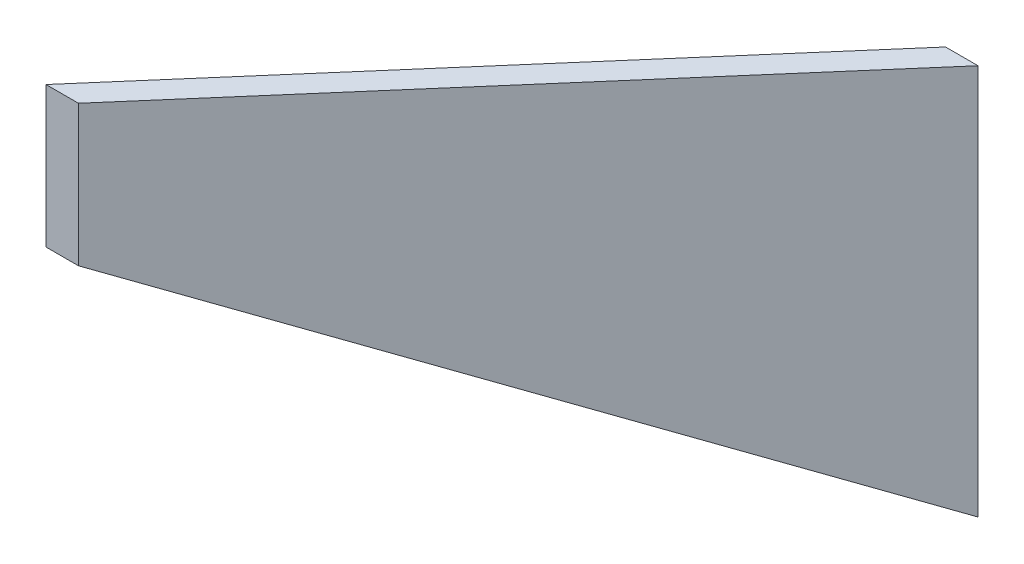
ISO-10303-21;
HEADER;
FILE_DESCRIPTION(('STEP AP214'),'2;1');
FILE_NAME('part.step','',(''),(''),'','','');
FILE_SCHEMA(('AUTOMOTIVE_DESIGN { 1 0 10303 214 1 1 1 1 }'));
ENDSEC;
DATA;
#1=APPLICATION_CONTEXT('core data for automotive mechanical design processes');
#2=APPLICATION_PROTOCOL_DEFINITION('international standard','automotive_design',2000,#1);
#3=PRODUCT_CONTEXT('',#1,'mechanical');
#4=PRODUCT('Part','Part','',(#3));
#5=PRODUCT_RELATED_PRODUCT_CATEGORY('part','',(#4));
#6=PRODUCT_DEFINITION_FORMATION('','',#4);
#7=PRODUCT_DEFINITION_CONTEXT('part definition',#1,'design');
#8=PRODUCT_DEFINITION('design','',#6,#7);
#9=PRODUCT_DEFINITION_SHAPE('','',#8);
#10=(LENGTH_UNIT() NAMED_UNIT(*) SI_UNIT(.MILLI.,.METRE.));
#11=(NAMED_UNIT(*) PLANE_ANGLE_UNIT() SI_UNIT($,.RADIAN.));
#12=(NAMED_UNIT(*) SI_UNIT($,.STERADIAN.) SOLID_ANGLE_UNIT());
#13=UNCERTAINTY_MEASURE_WITH_UNIT(LENGTH_MEASURE(1.E-05),#10,'distance_accuracy_value','');
#14=(GEOMETRIC_REPRESENTATION_CONTEXT(3) GLOBAL_UNCERTAINTY_ASSIGNED_CONTEXT((#13)) GLOBAL_UNIT_ASSIGNED_CONTEXT((#10,
#11,#12)) REPRESENTATION_CONTEXT('',''));
#15=CARTESIAN_POINT('',(0.,0.,0.));
#16=DIRECTION('',(0.,0.,1.));
#17=DIRECTION('',(1.,0.,0.));
#18=AXIS2_PLACEMENT_3D('',#15,#16,#17);
#19=CARTESIAN_POINT('',(0.,0.,127.));
#20=DIRECTION('',(0.,0.,-1.));
#21=DIRECTION('',(-1.,0.,0.));
#22=AXIS2_PLACEMENT_3D('',#19,#20,#21);
#23=PLANE('',#22);
#24=DIRECTION('',(-1.,0.,0.));
#25=VECTOR('',#24,1.);
#26=CARTESIAN_POINT('',(0.,51.1777043818824,127.));
#27=LINE('',#26,#25);
#28=CARTESIAN_POINT('',(31.7500000000001,51.1777043818824,127.));
#29=VERTEX_POINT('',#28);
#30=CARTESIAN_POINT('',(20.2070972242681,51.1777043818824,127.));
#31=VERTEX_POINT('',#30);
#32=EDGE_CURVE('E13',#29,#31,#27,.T.);
#33=ORIENTED_EDGE('',*,*,#32,.F.);
#34=DIRECTION('',(0.,-1.,0.));
#35=VECTOR('',#34,1.);
#36=CARTESIAN_POINT('',(31.7500000000001,152.4,127.));
#37=LINE('',#36,#35);
#38=CARTESIAN_POINT('',(31.7500000000001,101.222295618118,127.));
#39=VERTEX_POINT('',#38);
#40=EDGE_CURVE('E95',#39,#29,#37,.T.);
#41=ORIENTED_EDGE('',*,*,#40,.F.);
#42=DIRECTION('',(1.,0.,0.));
#43=VECTOR('',#42,1.);
#44=CARTESIAN_POINT('',(0.,101.222295618118,127.));
#45=LINE('',#44,#43);
#46=CARTESIAN_POINT('',(20.2070972242681,101.222295618118,127.));
#47=VERTEX_POINT('',#46);
#48=EDGE_CURVE('E48',#47,#39,#45,.T.);
#49=ORIENTED_EDGE('',*,*,#48,.F.);
#50=DIRECTION('',(0.,-1.,0.));
#51=VECTOR('',#50,1.);
#52=CARTESIAN_POINT('',(20.2070972242681,152.4,127.));
#53=LINE('',#52,#51);
#54=EDGE_CURVE('E96',#47,#31,#53,.T.);
#55=ORIENTED_EDGE('',*,*,#54,.T.);
#56=EDGE_LOOP('',(#33,#41,#49,#55));
#57=FACE_BOUND('',#56,.T.);
#58=ADVANCED_FACE('F40',(#57),#23,.F.);
#59=CARTESIAN_POINT('',(221.042727919014,152.4,-5.30278701893673));
#60=DIRECTION('',(-0.550121587556848,0.,-0.835084569911295));
#61=DIRECTION('',(-0.835084569911295,0.,0.550121587556848));
#62=AXIS2_PLACEMENT_3D('',#59,#60,#61);
#63=PLANE('',#62);
#64=ORIENTED_EDGE('',*,*,#54,.F.);
#65=DIRECTION('',(-0.820022694098076,-0.189069791129332,0.540199403226664));
#66=VECTOR('',#65,1.);
#67=CARTESIAN_POINT('',(221.79804817415,147.702422648723,-5.80036294458657));
#68=LINE('',#67,#66);
#69=CARTESIAN_POINT('',(212.993097224268,145.672295618118,0.));
#70=VERTEX_POINT('',#69);
#71=EDGE_CURVE('E62',#70,#47,#68,.T.);
#72=ORIENTED_EDGE('',*,*,#71,.F.);
#73=DIRECTION('',(0.,-1.,0.));
#74=VECTOR('',#73,1.);
#75=CARTESIAN_POINT('',(212.993097224268,152.4,0.));
#76=LINE('',#75,#74);
#77=CARTESIAN_POINT('',(212.993097224268,6.72770438188243,0.));
#78=VERTEX_POINT('',#77);
#79=EDGE_CURVE('E100',#70,#78,#76,.T.);
#80=ORIENTED_EDGE('',*,*,#79,.T.);
#81=DIRECTION('',(0.820022694098076,-0.189069791129332,-0.540199403226664));
#82=VECTOR('',#81,1.);
#83=CARTESIAN_POINT('',(198.169720603198,10.145478965133,9.76507023785876));
#84=LINE('',#83,#82);
#85=EDGE_CURVE('E81',#31,#78,#84,.T.);
#86=ORIENTED_EDGE('',*,*,#85,.F.);
#87=EDGE_LOOP('',(#64,#72,#80,#86));
#88=FACE_BOUND('',#87,.T.);
#89=ADVANCED_FACE('F113',(#88),#63,.T.);
#90=CARTESIAN_POINT('',(224.536,152.4,0.));
#91=DIRECTION('',(-0.550121587556848,0.,-0.835084569911295));
#92=DIRECTION('',(-0.835084569911295,0.,0.550121587556848));
#93=AXIS2_PLACEMENT_3D('',#90,#91,#92);
#94=PLANE('',#93);
#95=DIRECTION('',(-0.820022694098076,0.189069791129332,0.540199403226664));
#96=VECTOR('',#95,1.);
#97=CARTESIAN_POINT('',(201.950745939124,11.935108150859,14.8782964827902));
#98=LINE('',#97,#96);
#99=CARTESIAN_POINT('',(224.536,6.72770438188243,0.));
#100=VERTEX_POINT('',#99);
#101=EDGE_CURVE('E54',#100,#29,#98,.T.);
#102=ORIENTED_EDGE('',*,*,#101,.F.);
#103=DIRECTION('',(0.,-1.,0.));
#104=VECTOR('',#103,1.);
#105=CARTESIAN_POINT('',(224.536,152.4,0.));
#106=LINE('',#105,#104);
#107=CARTESIAN_POINT('',(224.536,145.672295618118,0.));
#108=VERTEX_POINT('',#107);
#109=EDGE_CURVE('E93',#108,#100,#106,.T.);
#110=ORIENTED_EDGE('',*,*,#109,.F.);
#111=DIRECTION('',(0.820022694098076,0.189069791129333,-0.540199403226664));
#112=VECTOR('',#111,1.);
#113=CARTESIAN_POINT('',(225.579073510076,145.912793462997,-0.687136699655089));
#114=LINE('',#113,#112);
#115=EDGE_CURVE('E86',#39,#108,#114,.T.);
#116=ORIENTED_EDGE('',*,*,#115,.F.);
#117=ORIENTED_EDGE('',*,*,#40,.T.);
#118=EDGE_LOOP('',(#102,#110,#116,#117));
#119=FACE_BOUND('',#118,.T.);
#120=ADVANCED_FACE('F42',(#119),#94,.F.);
#121=CARTESIAN_POINT('',(-57.15,152.4,0.));
#122=DIRECTION('',(0.,0.,1.));
#123=DIRECTION('',(1.,0.,0.));
#124=AXIS2_PLACEMENT_3D('',#121,#122,#123);
#125=PLANE('',#124);
#126=DIRECTION('',(-1.,0.,0.));
#127=VECTOR('',#126,1.);
#128=CARTESIAN_POINT('',(224.536,6.72770438188243,0.));
#129=LINE('',#128,#127);
#130=EDGE_CURVE('E78',#100,#78,#129,.T.);
#131=ORIENTED_EDGE('',*,*,#130,.T.);
#132=ORIENTED_EDGE('',*,*,#79,.F.);
#133=DIRECTION('',(-1.,0.,0.));
#134=VECTOR('',#133,1.);
#135=CARTESIAN_POINT('',(224.536,145.672295618118,0.));
#136=LINE('',#135,#134);
#137=EDGE_CURVE('E87',#108,#70,#136,.T.);
#138=ORIENTED_EDGE('',*,*,#137,.F.);
#139=ORIENTED_EDGE('',*,*,#109,.T.);
#140=EDGE_LOOP('',(#131,#132,#138,#139));
#141=FACE_BOUND('',#140,.T.);
#142=ADVANCED_FACE('F99',(#141),#125,.F.);
#143=CARTESIAN_POINT('',(224.536,145.672295618118,0.));
#144=DIRECTION('',(0.,0.943858356366017,0.330350424728106));
#145=DIRECTION('',(0.,-0.330350424728106,0.943858356366017));
#146=AXIS2_PLACEMENT_3D('',#143,#144,#145);
#147=PLANE('',#146);
#148=ORIENTED_EDGE('',*,*,#48,.T.);
#149=ORIENTED_EDGE('',*,*,#115,.T.);
#150=ORIENTED_EDGE('',*,*,#137,.T.);
#151=ORIENTED_EDGE('',*,*,#71,.T.);
#152=EDGE_LOOP('',(#148,#149,#150,#151));
#153=FACE_BOUND('',#152,.T.);
#154=ADVANCED_FACE('F110',(#153),#147,.T.);
#155=CARTESIAN_POINT('',(224.536,64.1142585145949,163.961583236321));
#156=DIRECTION('',(0.,-0.943858356366017,0.330350424728106));
#157=DIRECTION('',(0.,-0.330350424728106,-0.943858356366017));
#158=AXIS2_PLACEMENT_3D('',#155,#156,#157);
#159=PLANE('',#158);
#160=ORIENTED_EDGE('',*,*,#130,.F.);
#161=ORIENTED_EDGE('',*,*,#101,.T.);
#162=ORIENTED_EDGE('',*,*,#32,.T.);
#163=ORIENTED_EDGE('',*,*,#85,.T.);
#164=EDGE_LOOP('',(#160,#161,#162,#163));
#165=FACE_BOUND('',#164,.T.);
#166=ADVANCED_FACE('F79',(#165),#159,.T.);
#167=CLOSED_SHELL('',(#58,#89,#120,#142,#154,#166));
#168=MANIFOLD_SOLID_BREP('B2',#167);
#169=ADVANCED_BREP_SHAPE_REPRESENTATION('',(#18,#168),#14);
#170=SHAPE_DEFINITION_REPRESENTATION(#9,#169);
ENDSEC;
END-ISO-10303-21;
